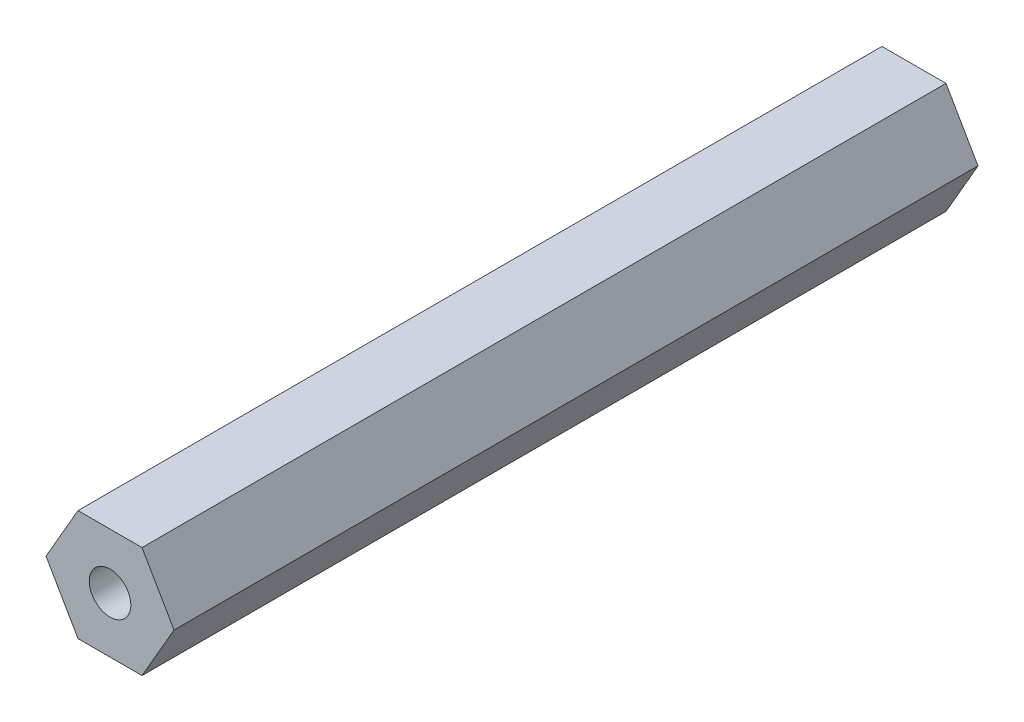
ISO-10303-21;
HEADER;
FILE_DESCRIPTION(('STEP AP214'),'2;1');
FILE_NAME('part.step','',(''),(''),'','','');
FILE_SCHEMA(('AUTOMOTIVE_DESIGN { 1 0 10303 214 1 1 1 1 }'));
ENDSEC;
DATA;
#1=APPLICATION_CONTEXT('core data for automotive mechanical design processes');
#2=APPLICATION_PROTOCOL_DEFINITION('international standard','automotive_design',2000,#1);
#3=PRODUCT_CONTEXT('',#1,'mechanical');
#4=PRODUCT('Part','Part','',(#3));
#5=PRODUCT_RELATED_PRODUCT_CATEGORY('part','',(#4));
#6=PRODUCT_DEFINITION_FORMATION('','',#4);
#7=PRODUCT_DEFINITION_CONTEXT('part definition',#1,'design');
#8=PRODUCT_DEFINITION('design','',#6,#7);
#9=PRODUCT_DEFINITION_SHAPE('','',#8);
#10=(LENGTH_UNIT() NAMED_UNIT(*) SI_UNIT(.MILLI.,.METRE.));
#11=(NAMED_UNIT(*) PLANE_ANGLE_UNIT() SI_UNIT($,.RADIAN.));
#12=(NAMED_UNIT(*) SI_UNIT($,.STERADIAN.) SOLID_ANGLE_UNIT());
#13=UNCERTAINTY_MEASURE_WITH_UNIT(LENGTH_MEASURE(1.E-05),#10,'distance_accuracy_value','');
#14=(GEOMETRIC_REPRESENTATION_CONTEXT(3) GLOBAL_UNCERTAINTY_ASSIGNED_CONTEXT((#13)) GLOBAL_UNIT_ASSIGNED_CONTEXT((#10,
#11,#12)) REPRESENTATION_CONTEXT('',''));
#15=CARTESIAN_POINT('',(0.,0.,0.));
#16=DIRECTION('',(0.,0.,1.));
#17=DIRECTION('',(1.,0.,0.));
#18=AXIS2_PLACEMENT_3D('',#15,#16,#17);
#19=CARTESIAN_POINT('',(0.,0.,29.));
#20=DIRECTION('',(0.,0.,1.));
#21=DIRECTION('',(1.,0.,0.));
#22=AXIS2_PLACEMENT_3D('',#19,#20,#21);
#23=PLANE('',#22);
#24=DIRECTION('',(0.499999999999995,0.866025403784441,0.));
#25=VECTOR('',#24,1.);
#26=CARTESIAN_POINT('',(2.30940107675855,-3.99999999999998,29.));
#27=LINE('',#26,#25);
#28=CARTESIAN_POINT('',(2.30940107675855,-3.99999999999998,29.));
#29=VERTEX_POINT('',#28);
#30=CARTESIAN_POINT('',(4.61880215351701,0.,29.));
#31=VERTEX_POINT('',#30);
#32=EDGE_CURVE('E146',#29,#31,#27,.T.);
#33=ORIENTED_EDGE('',*,*,#32,.T.);
#34=DIRECTION('',(-0.500000000000001,0.866025403784438,0.));
#35=VECTOR('',#34,1.);
#36=CARTESIAN_POINT('',(4.61880215351701,0.,29.));
#37=LINE('',#36,#35);
#38=CARTESIAN_POINT('',(2.3094010767585,4.00000000000001,29.));
#39=VERTEX_POINT('',#38);
#40=EDGE_CURVE('E94',#31,#39,#37,.T.);
#41=ORIENTED_EDGE('',*,*,#40,.T.);
#42=DIRECTION('',(-1.,0.,0.));
#43=VECTOR('',#42,1.);
#44=CARTESIAN_POINT('',(2.3094010767585,4.00000000000001,29.));
#45=LINE('',#44,#43);
#46=CARTESIAN_POINT('',(-2.30940107675852,3.99999999999999,29.));
#47=VERTEX_POINT('',#46);
#48=EDGE_CURVE('E107',#39,#47,#45,.T.);
#49=ORIENTED_EDGE('',*,*,#48,.T.);
#50=DIRECTION('',(-0.499999999999995,-0.866025403784441,0.));
#51=VECTOR('',#50,1.);
#52=CARTESIAN_POINT('',(-2.30940107675852,3.99999999999999,29.));
#53=LINE('',#52,#51);
#54=CARTESIAN_POINT('',(-4.61880215351701,0.,29.));
#55=VERTEX_POINT('',#54);
#56=EDGE_CURVE('E101',#47,#55,#53,.T.);
#57=ORIENTED_EDGE('',*,*,#56,.T.);
#58=DIRECTION('',(0.500000000000007,-0.866025403784435,0.));
#59=VECTOR('',#58,1.);
#60=CARTESIAN_POINT('',(-4.61880215351701,0.,29.));
#61=LINE('',#60,#59);
#62=CARTESIAN_POINT('',(-2.30940107675847,-4.00000000000002,29.));
#63=VERTEX_POINT('',#62);
#64=EDGE_CURVE('E105',#55,#63,#61,.T.);
#65=ORIENTED_EDGE('',*,*,#64,.T.);
#66=DIRECTION('',(1.,0.,0.));
#67=VECTOR('',#66,1.);
#68=CARTESIAN_POINT('',(-2.30940107675847,-4.00000000000002,29.));
#69=LINE('',#68,#67);
#70=EDGE_CURVE('E57',#63,#29,#69,.T.);
#71=ORIENTED_EDGE('',*,*,#70,.T.);
#72=EDGE_LOOP('',(#33,#41,#49,#57,#65,#71));
#73=FACE_BOUND('',#72,.T.);
#74=CARTESIAN_POINT('',(0.,0.,29.));
#75=DIRECTION('',(0.,0.,1.));
#76=DIRECTION('',(1.,0.,0.));
#77=AXIS2_PLACEMENT_3D('',#74,#75,#76);
#78=CIRCLE('',#77,1.5);
#79=CARTESIAN_POINT('',(-1.5,0.,29.));
#80=VERTEX_POINT('',#79);
#81=EDGE_CURVE('E134',#80,#80,#78,.T.);
#82=ORIENTED_EDGE('',*,*,#81,.F.);
#83=EDGE_LOOP('',(#82));
#84=FACE_BOUND('',#83,.T.);
#85=ADVANCED_FACE('F39',(#73,#84),#23,.T.);
#86=CARTESIAN_POINT('',(0.,0.,-29.));
#87=DIRECTION('',(0.,0.,1.));
#88=DIRECTION('',(1.,0.,0.));
#89=AXIS2_PLACEMENT_3D('',#86,#87,#88);
#90=PLANE('',#89);
#91=DIRECTION('',(0.499999999999995,0.866025403784441,0.));
#92=VECTOR('',#91,1.);
#93=CARTESIAN_POINT('',(2.30940107675855,-3.99999999999998,-29.));
#94=LINE('',#93,#92);
#95=CARTESIAN_POINT('',(2.30940107675855,-3.99999999999998,-29.));
#96=VERTEX_POINT('',#95);
#97=CARTESIAN_POINT('',(4.61880215351701,0.,-29.));
#98=VERTEX_POINT('',#97);
#99=EDGE_CURVE('E129',#96,#98,#94,.T.);
#100=ORIENTED_EDGE('',*,*,#99,.F.);
#101=DIRECTION('',(1.,0.,0.));
#102=VECTOR('',#101,1.);
#103=CARTESIAN_POINT('',(-2.30940107675847,-4.00000000000002,-29.));
#104=LINE('',#103,#102);
#105=CARTESIAN_POINT('',(-2.30940107675847,-4.00000000000002,-29.));
#106=VERTEX_POINT('',#105);
#107=EDGE_CURVE('E86',#106,#96,#104,.T.);
#108=ORIENTED_EDGE('',*,*,#107,.F.);
#109=DIRECTION('',(0.500000000000007,-0.866025403784435,0.));
#110=VECTOR('',#109,1.);
#111=CARTESIAN_POINT('',(-4.61880215351701,0.,-29.));
#112=LINE('',#111,#110);
#113=CARTESIAN_POINT('',(-4.61880215351701,0.,-29.));
#114=VERTEX_POINT('',#113);
#115=EDGE_CURVE('E80',#114,#106,#112,.T.);
#116=ORIENTED_EDGE('',*,*,#115,.F.);
#117=DIRECTION('',(-0.499999999999995,-0.866025403784441,0.));
#118=VECTOR('',#117,1.);
#119=CARTESIAN_POINT('',(-2.30940107675852,3.99999999999999,-29.));
#120=LINE('',#119,#118);
#121=CARTESIAN_POINT('',(-2.30940107675852,3.99999999999999,-29.));
#122=VERTEX_POINT('',#121);
#123=EDGE_CURVE('E116',#122,#114,#120,.T.);
#124=ORIENTED_EDGE('',*,*,#123,.F.);
#125=DIRECTION('',(-1.,0.,0.));
#126=VECTOR('',#125,1.);
#127=CARTESIAN_POINT('',(2.3094010767585,4.00000000000001,-29.));
#128=LINE('',#127,#126);
#129=CARTESIAN_POINT('',(2.3094010767585,4.00000000000001,-29.));
#130=VERTEX_POINT('',#129);
#131=EDGE_CURVE('E137',#130,#122,#128,.T.);
#132=ORIENTED_EDGE('',*,*,#131,.F.);
#133=DIRECTION('',(-0.500000000000001,0.866025403784438,0.));
#134=VECTOR('',#133,1.);
#135=CARTESIAN_POINT('',(4.61880215351701,0.,-29.));
#136=LINE('',#135,#134);
#137=EDGE_CURVE('E133',#98,#130,#136,.T.);
#138=ORIENTED_EDGE('',*,*,#137,.F.);
#139=EDGE_LOOP('',(#100,#108,#116,#124,#132,#138));
#140=FACE_BOUND('',#139,.T.);
#141=CARTESIAN_POINT('',(0.,0.,-29.));
#142=DIRECTION('',(0.,0.,1.));
#143=DIRECTION('',(1.,0.,0.));
#144=AXIS2_PLACEMENT_3D('',#141,#142,#143);
#145=CIRCLE('',#144,1.5);
#146=CARTESIAN_POINT('',(-1.5,0.,-29.));
#147=VERTEX_POINT('',#146);
#148=EDGE_CURVE('E243',#147,#147,#145,.T.);
#149=ORIENTED_EDGE('',*,*,#148,.T.);
#150=EDGE_LOOP('',(#149));
#151=FACE_BOUND('',#150,.T.);
#152=ADVANCED_FACE('F159',(#140,#151),#90,.F.);
#153=CARTESIAN_POINT('',(2.30940107675855,-3.99999999999998,29.));
#154=DIRECTION('',(-0.866025403784442,0.499999999999995,0.));
#155=DIRECTION('',(-0.499999999999995,-0.866025403784442,0.));
#156=AXIS2_PLACEMENT_3D('',#153,#154,#155);
#157=PLANE('',#156);
#158=ORIENTED_EDGE('',*,*,#99,.T.);
#159=DIRECTION('',(0.,0.,-1.));
#160=VECTOR('',#159,1.);
#161=CARTESIAN_POINT('',(4.61880215351701,0.,29.));
#162=LINE('',#161,#160);
#163=EDGE_CURVE('E11',#31,#98,#162,.T.);
#164=ORIENTED_EDGE('',*,*,#163,.F.);
#165=ORIENTED_EDGE('',*,*,#32,.F.);
#166=DIRECTION('',(0.,0.,-1.));
#167=VECTOR('',#166,1.);
#168=CARTESIAN_POINT('',(2.30940107675855,-3.99999999999998,29.));
#169=LINE('',#168,#167);
#170=EDGE_CURVE('E125',#29,#96,#169,.T.);
#171=ORIENTED_EDGE('',*,*,#170,.T.);
#172=EDGE_LOOP('',(#158,#164,#165,#171));
#173=FACE_BOUND('',#172,.T.);
#174=ADVANCED_FACE('F41',(#173),#157,.F.);
#175=CARTESIAN_POINT('',(4.61880215351701,0.,29.));
#176=DIRECTION('',(-0.866025403784438,-0.500000000000001,0.));
#177=DIRECTION('',(0.500000000000001,-0.866025403784438,0.));
#178=AXIS2_PLACEMENT_3D('',#175,#176,#177);
#179=PLANE('',#178);
#180=ORIENTED_EDGE('',*,*,#137,.T.);
#181=DIRECTION('',(0.,0.,-1.));
#182=VECTOR('',#181,1.);
#183=CARTESIAN_POINT('',(2.3094010767585,4.00000000000001,29.));
#184=LINE('',#183,#182);
#185=EDGE_CURVE('E49',#39,#130,#184,.T.);
#186=ORIENTED_EDGE('',*,*,#185,.F.);
#187=ORIENTED_EDGE('',*,*,#40,.F.);
#188=ORIENTED_EDGE('',*,*,#163,.T.);
#189=EDGE_LOOP('',(#180,#186,#187,#188));
#190=FACE_BOUND('',#189,.T.);
#191=ADVANCED_FACE('F184',(#190),#179,.F.);
#192=CARTESIAN_POINT('',(2.3094010767585,4.00000000000001,29.));
#193=DIRECTION('',(0.,-1.,0.));
#194=DIRECTION('',(1.,0.,0.));
#195=AXIS2_PLACEMENT_3D('',#192,#193,#194);
#196=PLANE('',#195);
#197=ORIENTED_EDGE('',*,*,#131,.T.);
#198=DIRECTION('',(0.,0.,-1.));
#199=VECTOR('',#198,1.);
#200=CARTESIAN_POINT('',(-2.30940107675852,3.99999999999999,29.));
#201=LINE('',#200,#199);
#202=EDGE_CURVE('E118',#47,#122,#201,.T.);
#203=ORIENTED_EDGE('',*,*,#202,.F.);
#204=ORIENTED_EDGE('',*,*,#48,.F.);
#205=ORIENTED_EDGE('',*,*,#185,.T.);
#206=EDGE_LOOP('',(#197,#203,#204,#205));
#207=FACE_BOUND('',#206,.T.);
#208=ADVANCED_FACE('F156',(#207),#196,.F.);
#209=CARTESIAN_POINT('',(-2.30940107675852,3.99999999999999,29.));
#210=DIRECTION('',(0.866025403784442,-0.499999999999995,0.));
#211=DIRECTION('',(0.499999999999995,0.866025403784442,0.));
#212=AXIS2_PLACEMENT_3D('',#209,#210,#211);
#213=PLANE('',#212);
#214=ORIENTED_EDGE('',*,*,#123,.T.);
#215=DIRECTION('',(0.,0.,-1.));
#216=VECTOR('',#215,1.);
#217=CARTESIAN_POINT('',(-4.61880215351701,0.,29.));
#218=LINE('',#217,#216);
#219=EDGE_CURVE('E113',#55,#114,#218,.T.);
#220=ORIENTED_EDGE('',*,*,#219,.F.);
#221=ORIENTED_EDGE('',*,*,#56,.F.);
#222=ORIENTED_EDGE('',*,*,#202,.T.);
#223=EDGE_LOOP('',(#214,#220,#221,#222));
#224=FACE_BOUND('',#223,.T.);
#225=ADVANCED_FACE('F114',(#224),#213,.F.);
#226=CARTESIAN_POINT('',(-4.61880215351701,0.,29.));
#227=DIRECTION('',(0.866025403784435,0.500000000000007,0.));
#228=DIRECTION('',(-0.500000000000007,0.866025403784435,0.));
#229=AXIS2_PLACEMENT_3D('',#226,#227,#228);
#230=PLANE('',#229);
#231=ORIENTED_EDGE('',*,*,#115,.T.);
#232=DIRECTION('',(0.,0.,-1.));
#233=VECTOR('',#232,1.);
#234=CARTESIAN_POINT('',(-2.30940107675847,-4.00000000000002,29.));
#235=LINE('',#234,#233);
#236=EDGE_CURVE('E119',#63,#106,#235,.T.);
#237=ORIENTED_EDGE('',*,*,#236,.F.);
#238=ORIENTED_EDGE('',*,*,#64,.F.);
#239=ORIENTED_EDGE('',*,*,#219,.T.);
#240=EDGE_LOOP('',(#231,#237,#238,#239));
#241=FACE_BOUND('',#240,.T.);
#242=ADVANCED_FACE('F121',(#241),#230,.F.);
#243=CARTESIAN_POINT('',(-2.30940107675847,-4.00000000000002,29.));
#244=DIRECTION('',(0.,1.,0.));
#245=DIRECTION('',(-1.,0.,0.));
#246=AXIS2_PLACEMENT_3D('',#243,#244,#245);
#247=PLANE('',#246);
#248=ORIENTED_EDGE('',*,*,#107,.T.);
#249=ORIENTED_EDGE('',*,*,#170,.F.);
#250=ORIENTED_EDGE('',*,*,#70,.F.);
#251=ORIENTED_EDGE('',*,*,#236,.T.);
#252=EDGE_LOOP('',(#248,#249,#250,#251));
#253=FACE_BOUND('',#252,.T.);
#254=ADVANCED_FACE('F164',(#253),#247,.F.);
#255=CARTESIAN_POINT('',(0.,0.,29.));
#256=DIRECTION('',(0.,0.,-1.));
#257=DIRECTION('',(-1.,0.,0.));
#258=AXIS2_PLACEMENT_3D('',#255,#256,#257);
#259=CYLINDRICAL_SURFACE('',#258,1.5);
#260=CARTESIAN_POINT('',(-1.5,0.,29.));
#261=CARTESIAN_POINT('',(-1.5,0.,28.3958333333333));
#262=CARTESIAN_POINT('',(-1.5,0.,27.7916666666667));
#263=CARTESIAN_POINT('',(-1.5,0.,26.5833333333333));
#264=CARTESIAN_POINT('',(-1.5,0.,25.9791666666667));
#265=CARTESIAN_POINT('',(-1.5,0.,24.7708333333333));
#266=CARTESIAN_POINT('',(-1.5,0.,24.1666666666667));
#267=CARTESIAN_POINT('',(-1.5,0.,22.9583333333333));
#268=CARTESIAN_POINT('',(-1.5,0.,22.3541666666667));
#269=CARTESIAN_POINT('',(-1.5,0.,21.1458333333333));
#270=CARTESIAN_POINT('',(-1.5,0.,20.5416666666667));
#271=CARTESIAN_POINT('',(-1.5,0.,19.3333333333333));
#272=CARTESIAN_POINT('',(-1.5,0.,18.7291666666667));
#273=CARTESIAN_POINT('',(-1.5,0.,17.5208333333333));
#274=CARTESIAN_POINT('',(-1.5,0.,16.9166666666667));
#275=CARTESIAN_POINT('',(-1.5,0.,15.7083333333333));
#276=CARTESIAN_POINT('',(-1.5,0.,15.1041666666667));
#277=CARTESIAN_POINT('',(-1.5,0.,13.8958333333333));
#278=CARTESIAN_POINT('',(-1.5,0.,13.2916666666667));
#279=CARTESIAN_POINT('',(-1.5,0.,12.0833333333333));
#280=CARTESIAN_POINT('',(-1.5,0.,11.4791666666667));
#281=CARTESIAN_POINT('',(-1.5,0.,10.2708333333333));
#282=CARTESIAN_POINT('',(-1.5,0.,9.66666666666667));
#283=CARTESIAN_POINT('',(-1.5,0.,8.45833333333333));
#284=CARTESIAN_POINT('',(-1.5,0.,7.85416666666666));
#285=CARTESIAN_POINT('',(-1.5,0.,6.64583333333333));
#286=CARTESIAN_POINT('',(-1.5,0.,6.04166666666666));
#287=CARTESIAN_POINT('',(-1.5,0.,4.83333333333333));
#288=CARTESIAN_POINT('',(-1.5,0.,4.22916666666666));
#289=CARTESIAN_POINT('',(-1.5,0.,3.02083333333333));
#290=CARTESIAN_POINT('',(-1.5,0.,2.41666666666666));
#291=CARTESIAN_POINT('',(-1.5,0.,1.20833333333333));
#292=CARTESIAN_POINT('',(-1.5,0.,0.604166666666664));
#293=CARTESIAN_POINT('',(-1.5,0.,-0.604166666666671));
#294=CARTESIAN_POINT('',(-1.5,0.,-1.20833333333334));
#295=CARTESIAN_POINT('',(-1.5,0.,-2.41666666666667));
#296=CARTESIAN_POINT('',(-1.5,0.,-3.02083333333333));
#297=CARTESIAN_POINT('',(-1.5,0.,-4.22916666666667));
#298=CARTESIAN_POINT('',(-1.5,0.,-4.83333333333333));
#299=CARTESIAN_POINT('',(-1.5,0.,-6.04166666666666));
#300=CARTESIAN_POINT('',(-1.5,0.,-6.64583333333333));
#301=CARTESIAN_POINT('',(-1.5,0.,-7.85416666666666));
#302=CARTESIAN_POINT('',(-1.5,0.,-8.45833333333333));
#303=CARTESIAN_POINT('',(-1.5,0.,-9.66666666666667));
#304=CARTESIAN_POINT('',(-1.5,0.,-10.2708333333333));
#305=CARTESIAN_POINT('',(-1.5,0.,-11.4791666666667));
#306=CARTESIAN_POINT('',(-1.5,0.,-12.0833333333333));
#307=CARTESIAN_POINT('',(-1.5,0.,-13.2916666666667));
#308=CARTESIAN_POINT('',(-1.5,0.,-13.8958333333333));
#309=CARTESIAN_POINT('',(-1.5,0.,-15.1041666666667));
#310=CARTESIAN_POINT('',(-1.5,0.,-15.7083333333333));
#311=CARTESIAN_POINT('',(-1.5,0.,-16.9166666666667));
#312=CARTESIAN_POINT('',(-1.5,0.,-17.5208333333333));
#313=CARTESIAN_POINT('',(-1.5,0.,-18.7291666666667));
#314=CARTESIAN_POINT('',(-1.5,0.,-19.3333333333333));
#315=CARTESIAN_POINT('',(-1.5,0.,-20.5416666666667));
#316=CARTESIAN_POINT('',(-1.5,0.,-21.1458333333333));
#317=CARTESIAN_POINT('',(-1.5,0.,-22.3541666666667));
#318=CARTESIAN_POINT('',(-1.5,0.,-22.9583333333333));
#319=CARTESIAN_POINT('',(-1.5,0.,-24.1666666666667));
#320=CARTESIAN_POINT('',(-1.5,0.,-24.7708333333333));
#321=CARTESIAN_POINT('',(-1.5,0.,-25.9791666666667));
#322=CARTESIAN_POINT('',(-1.5,0.,-26.5833333333333));
#323=CARTESIAN_POINT('',(-1.5,0.,-27.7916666666667));
#324=CARTESIAN_POINT('',(-1.5,0.,-28.3958333333333));
#325=CARTESIAN_POINT('',(-1.5,0.,-29.));
#326=B_SPLINE_CURVE_WITH_KNOTS('',3,(#260,#261,#262,#263,#264,#265,#266,#267,#268,#269,#270,
#271,#272,#273,#274,#275,#276,#277,#278,#279,#280,#281,#282,#283,#284,#285,#286,#287,#288,#289,
#290,#291,#292,#293,#294,#295,#296,#297,#298,#299,#300,#301,#302,#303,#304,#305,#306,#307,#308,
#309,#310,#311,#312,#313,#314,#315,#316,#317,#318,#319,#320,#321,#322,#323,#324,#325),
.UNSPECIFIED.,.F.,.F.,(4,2,2,2,2,2,2,2,2,2,2,2,2,2,2,2,2,2,2,2,2,2,2,2,2,2,2,2,2,2,2,2,4),(0.,
1.8125,3.625,5.4375,7.25,9.0625,10.875,12.6875,14.5,16.3125,18.125,19.9375,21.75,23.5625,25.375,
27.1875,29.,30.8125,32.625,34.4375,36.25,38.0625,39.875,41.6875,43.5,45.3125,47.125,48.9375,
50.75,52.5625,54.375,56.1875,58.),.UNSPECIFIED.);
#327=EDGE_CURVE('BSEAM166',#80,#147,#326,.T.);
#328=ORIENTED_EDGE('',*,*,#81,.T.);
#329=ORIENTED_EDGE('',*,*,#148,.F.);
#330=ORIENTED_EDGE('',*,*,#327,.T.);
#331=ORIENTED_EDGE('',*,*,#327,.F.);
#332=EDGE_LOOP('',(#328,#330,#329,#331));
#333=FACE_BOUND('',#332,.T.);
#334=ADVANCED_FACE('F166',(#333),#259,.F.);
#335=CLOSED_SHELL('',(#85,#152,#174,#191,#208,#225,#242,#254,#334));
#336=MANIFOLD_SOLID_BREP('B2',#335);
#337=ADVANCED_BREP_SHAPE_REPRESENTATION('',(#18,#336),#14);
#338=SHAPE_DEFINITION_REPRESENTATION(#9,#337);
ENDSEC;
END-ISO-10303-21;
